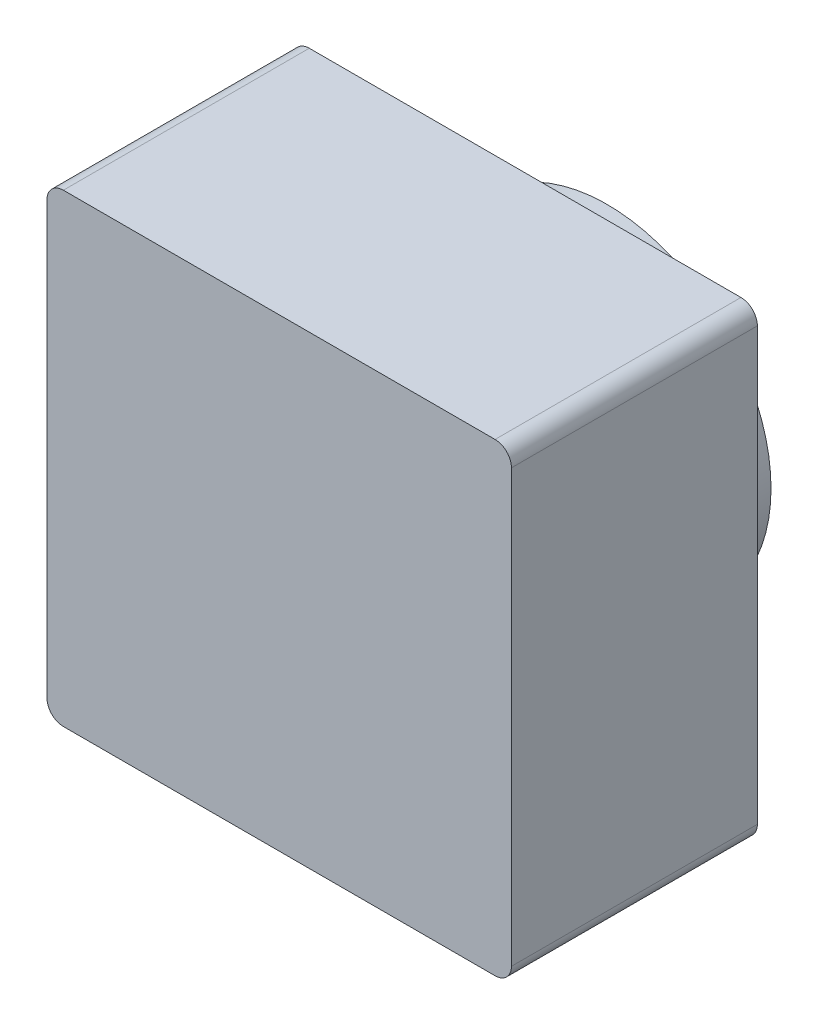
ISO-10303-21;
HEADER;
FILE_DESCRIPTION(('STEP AP214'),'2;1');
FILE_NAME('part.step','',(''),(''),'','','');
FILE_SCHEMA(('AUTOMOTIVE_DESIGN { 1 0 10303 214 1 1 1 1 }'));
ENDSEC;
DATA;
#1=APPLICATION_CONTEXT('core data for automotive mechanical design processes');
#2=APPLICATION_PROTOCOL_DEFINITION('international standard','automotive_design',2000,#1);
#3=PRODUCT_CONTEXT('',#1,'mechanical');
#4=PRODUCT('Part','Part','',(#3));
#5=PRODUCT_RELATED_PRODUCT_CATEGORY('part','',(#4));
#6=PRODUCT_DEFINITION_FORMATION('','',#4);
#7=PRODUCT_DEFINITION_CONTEXT('part definition',#1,'design');
#8=PRODUCT_DEFINITION('design','',#6,#7);
#9=PRODUCT_DEFINITION_SHAPE('','',#8);
#10=(LENGTH_UNIT() NAMED_UNIT(*) SI_UNIT(.MILLI.,.METRE.));
#11=(NAMED_UNIT(*) PLANE_ANGLE_UNIT() SI_UNIT($,.RADIAN.));
#12=(NAMED_UNIT(*) SI_UNIT($,.STERADIAN.) SOLID_ANGLE_UNIT());
#13=UNCERTAINTY_MEASURE_WITH_UNIT(LENGTH_MEASURE(1.E-05),#10,'distance_accuracy_value','');
#14=(GEOMETRIC_REPRESENTATION_CONTEXT(3) GLOBAL_UNCERTAINTY_ASSIGNED_CONTEXT((#13)) GLOBAL_UNIT_ASSIGNED_CONTEXT((#10,
#11,#12)) REPRESENTATION_CONTEXT('',''));
#15=CARTESIAN_POINT('',(0.,0.,0.));
#16=DIRECTION('',(0.,0.,1.));
#17=DIRECTION('',(1.,0.,0.));
#18=AXIS2_PLACEMENT_3D('',#15,#16,#17);
#19=CARTESIAN_POINT('',(-20.31,5.98999999999999,-14.7));
#20=DIRECTION('',(0.,0.,1.));
#21=DIRECTION('',(1.,0.,0.));
#22=AXIS2_PLACEMENT_3D('',#19,#20,#21);
#23=CYLINDRICAL_SURFACE('',#22,0.299999999999999);
#24=CARTESIAN_POINT('',(-20.31,5.98999999999999,-10.2));
#25=DIRECTION('',(0.,0.,1.));
#26=DIRECTION('',(1.,0.,0.));
#27=AXIS2_PLACEMENT_3D('',#24,#25,#26);
#28=CIRCLE('',#27,0.299999999999999);
#29=CARTESIAN_POINT('',(-20.61,5.99,-10.2));
#30=VERTEX_POINT('',#29);
#31=CARTESIAN_POINT('',(-20.31,5.69,-10.2));
#32=VERTEX_POINT('',#31);
#33=EDGE_CURVE('E136',#30,#32,#28,.T.);
#34=ORIENTED_EDGE('',*,*,#33,.F.);
#35=DIRECTION('',(0.,0.,1.));
#36=VECTOR('',#35,1.);
#37=CARTESIAN_POINT('',(-20.61,5.99,-14.7));
#38=LINE('',#37,#36);
#39=CARTESIAN_POINT('',(-20.61,5.99,-14.7));
#40=VERTEX_POINT('',#39);
#41=EDGE_CURVE('E11',#40,#30,#38,.T.);
#42=ORIENTED_EDGE('',*,*,#41,.F.);
#43=CARTESIAN_POINT('',(-20.31,5.98999999999999,-14.7));
#44=DIRECTION('',(0.,0.,1.));
#45=DIRECTION('',(1.,0.,0.));
#46=AXIS2_PLACEMENT_3D('',#43,#44,#45);
#47=CIRCLE('',#46,0.299999999999999);
#48=CARTESIAN_POINT('',(-20.31,5.69,-14.7));
#49=VERTEX_POINT('',#48);
#50=EDGE_CURVE('E160',#40,#49,#47,.T.);
#51=ORIENTED_EDGE('',*,*,#50,.T.);
#52=DIRECTION('',(0.,0.,1.));
#53=VECTOR('',#52,1.);
#54=CARTESIAN_POINT('',(-20.31,5.69,-14.7));
#55=LINE('',#54,#53);
#56=EDGE_CURVE('E45',#49,#32,#55,.T.);
#57=ORIENTED_EDGE('',*,*,#56,.T.);
#58=EDGE_LOOP('',(#34,#42,#51,#57));
#59=FACE_BOUND('',#58,.T.);
#60=ADVANCED_FACE('F39',(#59),#23,.T.);
#61=CARTESIAN_POINT('',(-20.61,13.89,-14.7));
#62=DIRECTION('',(-1.,0.,0.));
#63=DIRECTION('',(0.,0.,1.));
#64=AXIS2_PLACEMENT_3D('',#61,#62,#63);
#65=PLANE('',#64);
#66=DIRECTION('',(0.,-1.,0.));
#67=VECTOR('',#66,1.);
#68=CARTESIAN_POINT('',(-20.61,13.89,-10.2));
#69=LINE('',#68,#67);
#70=CARTESIAN_POINT('',(-20.61,13.89,-10.2));
#71=VERTEX_POINT('',#70);
#72=EDGE_CURVE('E154',#71,#30,#69,.T.);
#73=ORIENTED_EDGE('',*,*,#72,.F.);
#74=DIRECTION('',(0.,0.,1.));
#75=VECTOR('',#74,1.);
#76=CARTESIAN_POINT('',(-20.61,13.89,-14.7));
#77=LINE('',#76,#75);
#78=CARTESIAN_POINT('',(-20.61,13.89,-14.7));
#79=VERTEX_POINT('',#78);
#80=EDGE_CURVE('E48',#79,#71,#77,.T.);
#81=ORIENTED_EDGE('',*,*,#80,.F.);
#82=DIRECTION('',(0.,-1.,0.));
#83=VECTOR('',#82,1.);
#84=CARTESIAN_POINT('',(-20.61,13.89,-14.7));
#85=LINE('',#84,#83);
#86=EDGE_CURVE('E127',#79,#40,#85,.T.);
#87=ORIENTED_EDGE('',*,*,#86,.T.);
#88=ORIENTED_EDGE('',*,*,#41,.T.);
#89=EDGE_LOOP('',(#73,#81,#87,#88));
#90=FACE_BOUND('',#89,.T.);
#91=ADVANCED_FACE('F166',(#90),#65,.T.);
#92=CARTESIAN_POINT('',(-20.31,13.89,-14.7));
#93=DIRECTION('',(0.,0.,1.));
#94=DIRECTION('',(1.,0.,0.));
#95=AXIS2_PLACEMENT_3D('',#92,#93,#94);
#96=CYLINDRICAL_SURFACE('',#95,0.300000000000002);
#97=CARTESIAN_POINT('',(-20.31,13.89,-10.2));
#98=DIRECTION('',(0.,0.,1.));
#99=DIRECTION('',(1.,0.,0.));
#100=AXIS2_PLACEMENT_3D('',#97,#98,#99);
#101=CIRCLE('',#100,0.300000000000002);
#102=CARTESIAN_POINT('',(-20.31,14.19,-10.2));
#103=VERTEX_POINT('',#102);
#104=EDGE_CURVE('E114',#103,#71,#101,.T.);
#105=ORIENTED_EDGE('',*,*,#104,.F.);
#106=DIRECTION('',(0.,0.,1.));
#107=VECTOR('',#106,1.);
#108=CARTESIAN_POINT('',(-20.31,14.19,-14.7));
#109=LINE('',#108,#107);
#110=CARTESIAN_POINT('',(-20.31,14.19,-14.7));
#111=VERTEX_POINT('',#110);
#112=EDGE_CURVE('E107',#111,#103,#109,.T.);
#113=ORIENTED_EDGE('',*,*,#112,.F.);
#114=CARTESIAN_POINT('',(-20.31,13.89,-14.7));
#115=DIRECTION('',(0.,0.,1.));
#116=DIRECTION('',(1.,0.,0.));
#117=AXIS2_PLACEMENT_3D('',#114,#115,#116);
#118=CIRCLE('',#117,0.300000000000002);
#119=EDGE_CURVE('E112',#111,#79,#118,.T.);
#120=ORIENTED_EDGE('',*,*,#119,.T.);
#121=ORIENTED_EDGE('',*,*,#80,.T.);
#122=EDGE_LOOP('',(#105,#113,#120,#121));
#123=FACE_BOUND('',#122,.T.);
#124=ADVANCED_FACE('F109',(#123),#96,.T.);
#125=CARTESIAN_POINT('',(-12.41,14.19,-14.7));
#126=DIRECTION('',(0.,1.,0.));
#127=DIRECTION('',(0.,0.,1.));
#128=AXIS2_PLACEMENT_3D('',#125,#126,#127);
#129=PLANE('',#128);
#130=DIRECTION('',(-1.,0.,0.));
#131=VECTOR('',#130,1.);
#132=CARTESIAN_POINT('',(-12.41,14.19,-10.2));
#133=LINE('',#132,#131);
#134=CARTESIAN_POINT('',(-12.41,14.19,-10.2));
#135=VERTEX_POINT('',#134);
#136=EDGE_CURVE('E155',#135,#103,#133,.T.);
#137=ORIENTED_EDGE('',*,*,#136,.F.);
#138=DIRECTION('',(0.,0.,1.));
#139=VECTOR('',#138,1.);
#140=CARTESIAN_POINT('',(-12.41,14.19,-14.7));
#141=LINE('',#140,#139);
#142=CARTESIAN_POINT('',(-12.41,14.19,-14.7));
#143=VERTEX_POINT('',#142);
#144=EDGE_CURVE('E119',#143,#135,#141,.T.);
#145=ORIENTED_EDGE('',*,*,#144,.F.);
#146=DIRECTION('',(-1.,0.,0.));
#147=VECTOR('',#146,1.);
#148=CARTESIAN_POINT('',(-12.41,14.19,-14.7));
#149=LINE('',#148,#147);
#150=EDGE_CURVE('E123',#143,#111,#149,.T.);
#151=ORIENTED_EDGE('',*,*,#150,.T.);
#152=ORIENTED_EDGE('',*,*,#112,.T.);
#153=EDGE_LOOP('',(#137,#145,#151,#152));
#154=FACE_BOUND('',#153,.T.);
#155=ADVANCED_FACE('F126',(#154),#129,.T.);
#156=CARTESIAN_POINT('',(-12.41,13.89,-14.7));
#157=DIRECTION('',(0.,0.,1.));
#158=DIRECTION('',(1.,0.,0.));
#159=AXIS2_PLACEMENT_3D('',#156,#157,#158);
#160=CYLINDRICAL_SURFACE('',#159,0.300000000000004);
#161=CARTESIAN_POINT('',(-12.41,13.89,-10.2));
#162=DIRECTION('',(0.,0.,1.));
#163=DIRECTION('',(1.,0.,0.));
#164=AXIS2_PLACEMENT_3D('',#161,#162,#163);
#165=CIRCLE('',#164,0.300000000000004);
#166=CARTESIAN_POINT('',(-12.11,13.89,-10.2));
#167=VERTEX_POINT('',#166);
#168=EDGE_CURVE('E149',#167,#135,#165,.T.);
#169=ORIENTED_EDGE('',*,*,#168,.F.);
#170=DIRECTION('',(0.,0.,1.));
#171=VECTOR('',#170,1.);
#172=CARTESIAN_POINT('',(-12.11,13.89,-14.7));
#173=LINE('',#172,#171);
#174=CARTESIAN_POINT('',(-12.11,13.89,-14.7));
#175=VERTEX_POINT('',#174);
#176=EDGE_CURVE('E161',#175,#167,#173,.T.);
#177=ORIENTED_EDGE('',*,*,#176,.F.);
#178=CARTESIAN_POINT('',(-12.41,13.89,-14.7));
#179=DIRECTION('',(0.,0.,1.));
#180=DIRECTION('',(1.,0.,0.));
#181=AXIS2_PLACEMENT_3D('',#178,#179,#180);
#182=CIRCLE('',#181,0.300000000000004);
#183=EDGE_CURVE('E129',#175,#143,#182,.T.);
#184=ORIENTED_EDGE('',*,*,#183,.T.);
#185=ORIENTED_EDGE('',*,*,#144,.T.);
#186=EDGE_LOOP('',(#169,#177,#184,#185));
#187=FACE_BOUND('',#186,.T.);
#188=ADVANCED_FACE('F185',(#187),#160,.T.);
#189=CARTESIAN_POINT('',(-12.11,5.99,-14.7));
#190=DIRECTION('',(1.,0.,0.));
#191=DIRECTION('',(0.,0.,-1.));
#192=AXIS2_PLACEMENT_3D('',#189,#190,#191);
#193=PLANE('',#192);
#194=DIRECTION('',(0.,1.,0.));
#195=VECTOR('',#194,1.);
#196=CARTESIAN_POINT('',(-12.11,5.99,-10.2));
#197=LINE('',#196,#195);
#198=CARTESIAN_POINT('',(-12.11,5.99,-10.2));
#199=VERTEX_POINT('',#198);
#200=EDGE_CURVE('E148',#199,#167,#197,.T.);
#201=ORIENTED_EDGE('',*,*,#200,.F.);
#202=DIRECTION('',(0.,0.,1.));
#203=VECTOR('',#202,1.);
#204=CARTESIAN_POINT('',(-12.11,5.99,-14.7));
#205=LINE('',#204,#203);
#206=CARTESIAN_POINT('',(-12.11,5.99,-14.7));
#207=VERTEX_POINT('',#206);
#208=EDGE_CURVE('E162',#207,#199,#205,.T.);
#209=ORIENTED_EDGE('',*,*,#208,.F.);
#210=DIRECTION('',(0.,1.,0.));
#211=VECTOR('',#210,1.);
#212=CARTESIAN_POINT('',(-12.11,5.99,-14.7));
#213=LINE('',#212,#211);
#214=EDGE_CURVE('E132',#207,#175,#213,.T.);
#215=ORIENTED_EDGE('',*,*,#214,.T.);
#216=ORIENTED_EDGE('',*,*,#176,.T.);
#217=EDGE_LOOP('',(#201,#209,#215,#216));
#218=FACE_BOUND('',#217,.T.);
#219=ADVANCED_FACE('F183',(#218),#193,.T.);
#220=CARTESIAN_POINT('',(-12.41,5.99,-14.7));
#221=DIRECTION('',(0.,0.,1.));
#222=DIRECTION('',(1.,0.,0.));
#223=AXIS2_PLACEMENT_3D('',#220,#221,#222);
#224=CYLINDRICAL_SURFACE('',#223,0.300000000000002);
#225=CARTESIAN_POINT('',(-12.41,5.99,-10.2));
#226=DIRECTION('',(0.,0.,1.));
#227=DIRECTION('',(1.,0.,0.));
#228=AXIS2_PLACEMENT_3D('',#225,#226,#227);
#229=CIRCLE('',#228,0.300000000000002);
#230=CARTESIAN_POINT('',(-12.41,5.69,-10.2));
#231=VERTEX_POINT('',#230);
#232=EDGE_CURVE('E141',#231,#199,#229,.T.);
#233=ORIENTED_EDGE('',*,*,#232,.F.);
#234=DIRECTION('',(0.,0.,1.));
#235=VECTOR('',#234,1.);
#236=CARTESIAN_POINT('',(-12.41,5.69,-14.7));
#237=LINE('',#236,#235);
#238=CARTESIAN_POINT('',(-12.41,5.69,-14.7));
#239=VERTEX_POINT('',#238);
#240=EDGE_CURVE('E163',#239,#231,#237,.T.);
#241=ORIENTED_EDGE('',*,*,#240,.F.);
#242=CARTESIAN_POINT('',(-12.41,5.99,-14.7));
#243=DIRECTION('',(0.,0.,1.));
#244=DIRECTION('',(1.,0.,0.));
#245=AXIS2_PLACEMENT_3D('',#242,#243,#244);
#246=CIRCLE('',#245,0.300000000000002);
#247=EDGE_CURVE('E222',#239,#207,#246,.T.);
#248=ORIENTED_EDGE('',*,*,#247,.T.);
#249=ORIENTED_EDGE('',*,*,#208,.T.);
#250=EDGE_LOOP('',(#233,#241,#248,#249));
#251=FACE_BOUND('',#250,.T.);
#252=ADVANCED_FACE('F186',(#251),#224,.T.);
#253=CARTESIAN_POINT('',(-20.31,5.69,-14.7));
#254=DIRECTION('',(0.,-1.,0.));
#255=DIRECTION('',(0.,0.,-1.));
#256=AXIS2_PLACEMENT_3D('',#253,#254,#255);
#257=PLANE('',#256);
#258=DIRECTION('',(1.,0.,0.));
#259=VECTOR('',#258,1.);
#260=CARTESIAN_POINT('',(-20.31,5.69,-10.2));
#261=LINE('',#260,#259);
#262=EDGE_CURVE('E138',#32,#231,#261,.T.);
#263=ORIENTED_EDGE('',*,*,#262,.F.);
#264=ORIENTED_EDGE('',*,*,#56,.F.);
#265=DIRECTION('',(1.,0.,0.));
#266=VECTOR('',#265,1.);
#267=CARTESIAN_POINT('',(-20.31,5.69,-14.7));
#268=LINE('',#267,#266);
#269=EDGE_CURVE('E218',#49,#239,#268,.T.);
#270=ORIENTED_EDGE('',*,*,#269,.T.);
#271=ORIENTED_EDGE('',*,*,#240,.T.);
#272=EDGE_LOOP('',(#263,#264,#270,#271));
#273=FACE_BOUND('',#272,.T.);
#274=ADVANCED_FACE('F167',(#273),#257,.T.);
#275=CARTESIAN_POINT('',(-20.31,5.98999999999999,-14.7));
#276=DIRECTION('',(0.,0.,1.));
#277=DIRECTION('',(1.,0.,0.));
#278=AXIS2_PLACEMENT_3D('',#275,#276,#277);
#279=PLANE('',#278);
#280=CARTESIAN_POINT('',(-16.36,9.94,-14.7));
#281=DIRECTION('',(0.,0.,1.));
#282=DIRECTION('',(1.,0.,0.));
#283=AXIS2_PLACEMENT_3D('',#280,#281,#282);
#284=CIRCLE('',#283,3.);
#285=CARTESIAN_POINT('',(-13.36,9.94,-14.7));
#286=VERTEX_POINT('',#285);
#287=EDGE_CURVE('E212',#286,#286,#284,.T.);
#288=ORIENTED_EDGE('',*,*,#287,.T.);
#289=EDGE_LOOP('',(#288));
#290=FACE_BOUND('',#289,.T.);
#291=ORIENTED_EDGE('',*,*,#50,.F.);
#292=ORIENTED_EDGE('',*,*,#86,.F.);
#293=ORIENTED_EDGE('',*,*,#119,.F.);
#294=ORIENTED_EDGE('',*,*,#150,.F.);
#295=ORIENTED_EDGE('',*,*,#183,.F.);
#296=ORIENTED_EDGE('',*,*,#214,.F.);
#297=ORIENTED_EDGE('',*,*,#247,.F.);
#298=ORIENTED_EDGE('',*,*,#269,.F.);
#299=EDGE_LOOP('',(#291,#292,#293,#294,#295,#296,#297,#298));
#300=FACE_BOUND('',#299,.T.);
#301=ADVANCED_FACE('F125',(#290,#300),#279,.F.);
#302=CARTESIAN_POINT('',(-20.31,5.98999999999999,-10.2));
#303=DIRECTION('',(0.,0.,1.));
#304=DIRECTION('',(1.,0.,0.));
#305=AXIS2_PLACEMENT_3D('',#302,#303,#304);
#306=PLANE('',#305);
#307=ORIENTED_EDGE('',*,*,#33,.T.);
#308=ORIENTED_EDGE('',*,*,#262,.T.);
#309=ORIENTED_EDGE('',*,*,#232,.T.);
#310=ORIENTED_EDGE('',*,*,#200,.T.);
#311=ORIENTED_EDGE('',*,*,#168,.T.);
#312=ORIENTED_EDGE('',*,*,#136,.T.);
#313=ORIENTED_EDGE('',*,*,#104,.T.);
#314=ORIENTED_EDGE('',*,*,#72,.T.);
#315=EDGE_LOOP('',(#307,#308,#309,#310,#311,#312,#313,#314));
#316=FACE_BOUND('',#315,.T.);
#317=ADVANCED_FACE('F169',(#316),#306,.T.);
#318=CARTESIAN_POINT('',(-16.36,9.94,-16.2));
#319=DIRECTION('',(0.,0.,1.));
#320=DIRECTION('',(1.,0.,0.));
#321=AXIS2_PLACEMENT_3D('',#318,#319,#320);
#322=CYLINDRICAL_SURFACE('',#321,3.);
#323=CARTESIAN_POINT('',(-16.36,9.94,-16.2));
#324=DIRECTION('',(0.,0.,1.));
#325=DIRECTION('',(1.,0.,0.));
#326=AXIS2_PLACEMENT_3D('',#323,#324,#325);
#327=CIRCLE('',#326,3.);
#328=CARTESIAN_POINT('',(-13.36,9.94,-16.2));
#329=VERTEX_POINT('',#328);
#330=EDGE_CURVE('E139',#329,#329,#327,.T.);
#331=ORIENTED_EDGE('',*,*,#330,.T.);
#332=EDGE_LOOP('',(#331));
#333=FACE_BOUND('',#332,.T.);
#334=ORIENTED_EDGE('',*,*,#287,.F.);
#335=EDGE_LOOP('',(#334));
#336=FACE_BOUND('',#335,.T.);
#337=ADVANCED_FACE('F205',(#333,#336),#322,.T.);
#338=CARTESIAN_POINT('',(-16.36,9.94,-16.2));
#339=DIRECTION('',(0.,0.,1.));
#340=DIRECTION('',(1.,0.,0.));
#341=AXIS2_PLACEMENT_3D('',#338,#339,#340);
#342=PLANE('',#341);
#343=ORIENTED_EDGE('',*,*,#330,.F.);
#344=EDGE_LOOP('',(#343));
#345=FACE_BOUND('',#344,.T.);
#346=ADVANCED_FACE('F206',(#345),#342,.F.);
#347=CLOSED_SHELL('',(#60,#91,#124,#155,#188,#219,#252,#274,#301,#317,#337,#346));
#348=MANIFOLD_SOLID_BREP('B2',#347);
#349=ADVANCED_BREP_SHAPE_REPRESENTATION('',(#18,#348),#14);
#350=SHAPE_DEFINITION_REPRESENTATION(#9,#349);
ENDSEC;
END-ISO-10303-21;
